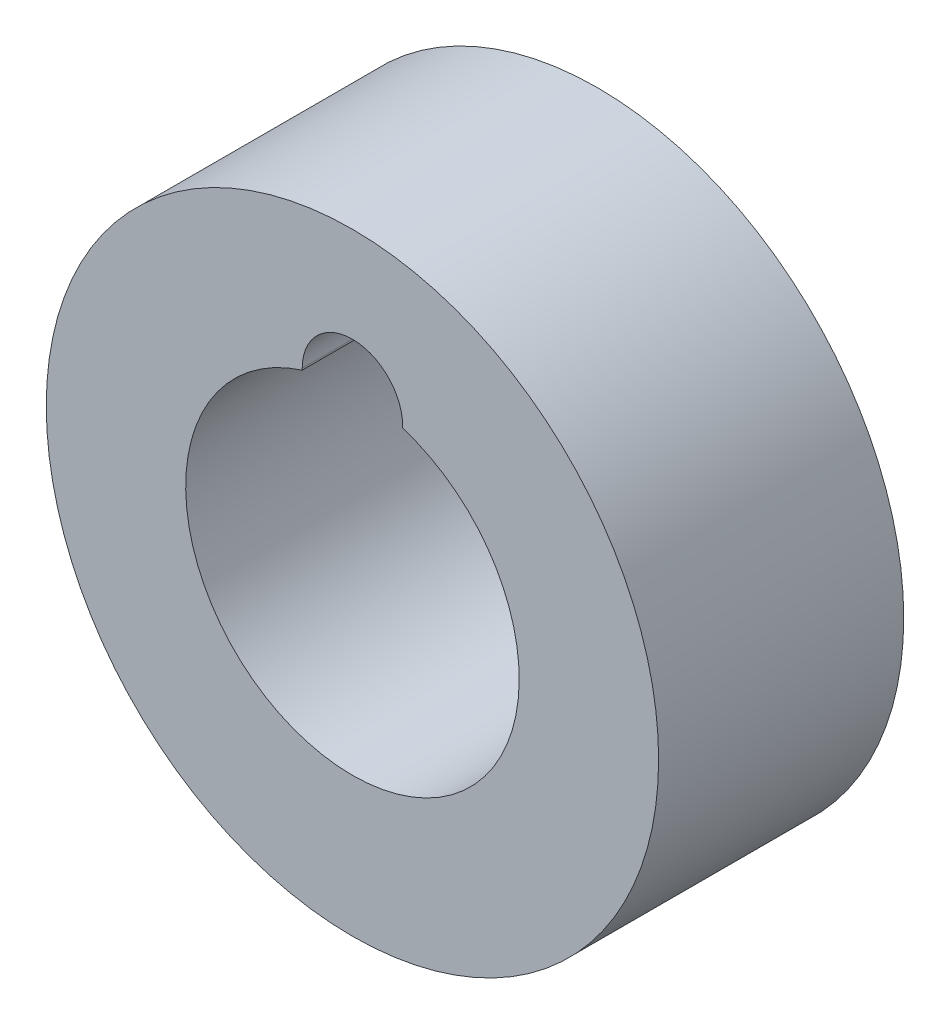
ISO-10303-21;
HEADER;
FILE_DESCRIPTION(('STEP AP214'),'2;1');
FILE_NAME('part.step','',(''),(''),'','','');
FILE_SCHEMA(('AUTOMOTIVE_DESIGN { 1 0 10303 214 1 1 1 1 }'));
ENDSEC;
DATA;
#1=APPLICATION_CONTEXT('core data for automotive mechanical design processes');
#2=APPLICATION_PROTOCOL_DEFINITION('international standard','automotive_design',2000,#1);
#3=PRODUCT_CONTEXT('',#1,'mechanical');
#4=PRODUCT('Part','Part','',(#3));
#5=PRODUCT_RELATED_PRODUCT_CATEGORY('part','',(#4));
#6=PRODUCT_DEFINITION_FORMATION('','',#4);
#7=PRODUCT_DEFINITION_CONTEXT('part definition',#1,'design');
#8=PRODUCT_DEFINITION('design','',#6,#7);
#9=PRODUCT_DEFINITION_SHAPE('','',#8);
#10=(LENGTH_UNIT() NAMED_UNIT(*) SI_UNIT(.MILLI.,.METRE.));
#11=(NAMED_UNIT(*) PLANE_ANGLE_UNIT() SI_UNIT($,.RADIAN.));
#12=(NAMED_UNIT(*) SI_UNIT($,.STERADIAN.) SOLID_ANGLE_UNIT());
#13=UNCERTAINTY_MEASURE_WITH_UNIT(LENGTH_MEASURE(1.E-05),#10,'distance_accuracy_value','');
#14=(GEOMETRIC_REPRESENTATION_CONTEXT(3) GLOBAL_UNCERTAINTY_ASSIGNED_CONTEXT((#13)) GLOBAL_UNIT_ASSIGNED_CONTEXT((#10,
#11,#12)) REPRESENTATION_CONTEXT('',''));
#15=CARTESIAN_POINT('',(0.,0.,0.));
#16=DIRECTION('',(0.,0.,1.));
#17=DIRECTION('',(1.,0.,0.));
#18=AXIS2_PLACEMENT_3D('',#15,#16,#17);
#19=CARTESIAN_POINT('',(0.,0.,6.099999992));
#20=DIRECTION('',(0.,0.,1.));
#21=DIRECTION('',(1.,0.,0.));
#22=AXIS2_PLACEMENT_3D('',#19,#20,#21);
#23=PLANE('',#22);
#24=DIRECTION('',(0.,-1.,0.));
#25=VECTOR('',#24,1.);
#26=CARTESIAN_POINT('',(-1.25,0.,6.099999992));
#27=LINE('',#26,#25);
#28=CARTESIAN_POINT('',(-1.25,4.,6.099999992));
#29=VERTEX_POINT('',#28);
#30=CARTESIAN_POINT('',(-1.25,3.95727178748188,6.099999992));
#31=VERTEX_POINT('',#30);
#32=EDGE_CURVE('E90',#29,#31,#27,.T.);
#33=ORIENTED_EDGE('',*,*,#32,.F.);
#34=CARTESIAN_POINT('',(0.,4.,6.099999992));
#35=DIRECTION('',(0.,0.,1.));
#36=DIRECTION('',(1.,0.,0.));
#37=AXIS2_PLACEMENT_3D('',#34,#35,#36);
#38=CIRCLE('',#37,1.25);
#39=CARTESIAN_POINT('',(1.25,4.,6.099999992));
#40=VERTEX_POINT('',#39);
#41=EDGE_CURVE('E92',#40,#29,#38,.T.);
#42=ORIENTED_EDGE('',*,*,#41,.F.);
#43=DIRECTION('',(0.,1.,0.));
#44=VECTOR('',#43,1.);
#45=CARTESIAN_POINT('',(1.25,0.,6.099999992));
#46=LINE('',#45,#44);
#47=CARTESIAN_POINT('',(1.25,3.95727178748188,6.099999992));
#48=VERTEX_POINT('',#47);
#49=EDGE_CURVE('E74',#48,#40,#46,.T.);
#50=ORIENTED_EDGE('',*,*,#49,.F.);
#51=CARTESIAN_POINT('',(0.,0.,6.099999992));
#52=DIRECTION('',(0.,0.,1.));
#53=DIRECTION('',(1.,0.,0.));
#54=AXIS2_PLACEMENT_3D('',#51,#52,#53);
#55=CIRCLE('',#54,4.15);
#56=EDGE_CURVE('E99',#31,#48,#55,.T.);
#57=ORIENTED_EDGE('',*,*,#56,.F.);
#58=EDGE_LOOP('',(#33,#42,#50,#57));
#59=FACE_BOUND('',#58,.T.);
#60=CARTESIAN_POINT('',(0.,0.,6.099999992));
#61=DIRECTION('',(0.,0.,1.));
#62=DIRECTION('',(1.,0.,0.));
#63=AXIS2_PLACEMENT_3D('',#60,#61,#62);
#64=CIRCLE('',#63,7.62);
#65=CARTESIAN_POINT('',(-7.62,0.,6.099999992));
#66=VERTEX_POINT('',#65);
#67=EDGE_CURVE('E104',#66,#66,#64,.T.);
#68=ORIENTED_EDGE('',*,*,#67,.T.);
#69=EDGE_LOOP('',(#68));
#70=FACE_BOUND('',#69,.T.);
#71=ADVANCED_FACE('F32',(#59,#70),#23,.T.);
#72=CARTESIAN_POINT('',(0.,0.,0.));
#73=DIRECTION('',(0.,0.,1.));
#74=DIRECTION('',(1.,0.,0.));
#75=AXIS2_PLACEMENT_3D('',#72,#73,#74);
#76=PLANE('',#75);
#77=CARTESIAN_POINT('',(0.,0.,0.));
#78=DIRECTION('',(0.,0.,1.));
#79=DIRECTION('',(1.,0.,0.));
#80=AXIS2_PLACEMENT_3D('',#77,#78,#79);
#81=CIRCLE('',#80,7.62);
#82=CARTESIAN_POINT('',(-7.62,0.,0.));
#83=VERTEX_POINT('',#82);
#84=EDGE_CURVE('E102',#83,#83,#81,.T.);
#85=ORIENTED_EDGE('',*,*,#84,.F.);
#86=EDGE_LOOP('',(#85));
#87=FACE_BOUND('',#86,.T.);
#88=CARTESIAN_POINT('',(0.,4.,0.));
#89=DIRECTION('',(0.,0.,1.));
#90=DIRECTION('',(1.,0.,0.));
#91=AXIS2_PLACEMENT_3D('',#88,#89,#90);
#92=CIRCLE('',#91,1.25);
#93=CARTESIAN_POINT('',(1.25,4.,0.));
#94=VERTEX_POINT('',#93);
#95=CARTESIAN_POINT('',(-1.25,4.,0.));
#96=VERTEX_POINT('',#95);
#97=EDGE_CURVE('E82',#94,#96,#92,.T.);
#98=ORIENTED_EDGE('',*,*,#97,.T.);
#99=DIRECTION('',(0.,-1.,0.));
#100=VECTOR('',#99,1.);
#101=CARTESIAN_POINT('',(-1.25,0.,0.));
#102=LINE('',#101,#100);
#103=CARTESIAN_POINT('',(-1.25,3.95727178748188,0.));
#104=VERTEX_POINT('',#103);
#105=EDGE_CURVE('E79',#96,#104,#102,.T.);
#106=ORIENTED_EDGE('',*,*,#105,.T.);
#107=CARTESIAN_POINT('',(0.,0.,0.));
#108=DIRECTION('',(0.,0.,1.));
#109=DIRECTION('',(1.,0.,0.));
#110=AXIS2_PLACEMENT_3D('',#107,#108,#109);
#111=CIRCLE('',#110,4.15);
#112=CARTESIAN_POINT('',(1.25,3.95727178748188,0.));
#113=VERTEX_POINT('',#112);
#114=EDGE_CURVE('E89',#104,#113,#111,.T.);
#115=ORIENTED_EDGE('',*,*,#114,.T.);
#116=DIRECTION('',(0.,1.,0.));
#117=VECTOR('',#116,1.);
#118=CARTESIAN_POINT('',(1.25,0.,0.));
#119=LINE('',#118,#117);
#120=EDGE_CURVE('E47',#113,#94,#119,.T.);
#121=ORIENTED_EDGE('',*,*,#120,.T.);
#122=EDGE_LOOP('',(#98,#106,#115,#121));
#123=FACE_BOUND('',#122,.T.);
#124=ADVANCED_FACE('F87',(#87,#123),#76,.F.);
#125=CARTESIAN_POINT('',(0.,0.,6.099999992));
#126=DIRECTION('',(0.,0.,-1.));
#127=DIRECTION('',(-1.,0.,0.));
#128=AXIS2_PLACEMENT_3D('',#125,#126,#127);
#129=CYLINDRICAL_SURFACE('',#128,7.62);
#130=CARTESIAN_POINT('',(-7.62,0.,6.099999992));
#131=CARTESIAN_POINT('',(-7.62,0.,6.03645832541667));
#132=CARTESIAN_POINT('',(-7.62,0.,5.97291665883333));
#133=CARTESIAN_POINT('',(-7.62,0.,5.84583332566667));
#134=CARTESIAN_POINT('',(-7.62,0.,5.78229165908333));
#135=CARTESIAN_POINT('',(-7.62,0.,5.65520832591667));
#136=CARTESIAN_POINT('',(-7.62,0.,5.59166665933333));
#137=CARTESIAN_POINT('',(-7.62,0.,5.46458332616667));
#138=CARTESIAN_POINT('',(-7.62,0.,5.40104165958333));
#139=CARTESIAN_POINT('',(-7.62,0.,5.27395832641667));
#140=CARTESIAN_POINT('',(-7.62,0.,5.21041665983333));
#141=CARTESIAN_POINT('',(-7.62,0.,5.08333332666667));
#142=CARTESIAN_POINT('',(-7.62,0.,5.01979166008333));
#143=CARTESIAN_POINT('',(-7.62,0.,4.89270832691667));
#144=CARTESIAN_POINT('',(-7.62,0.,4.82916666033333));
#145=CARTESIAN_POINT('',(-7.62,0.,4.70208332716667));
#146=CARTESIAN_POINT('',(-7.62,0.,4.63854166058333));
#147=CARTESIAN_POINT('',(-7.62,0.,4.51145832741667));
#148=CARTESIAN_POINT('',(-7.62,0.,4.44791666083333));
#149=CARTESIAN_POINT('',(-7.62,0.,4.32083332766667));
#150=CARTESIAN_POINT('',(-7.62,0.,4.25729166108333));
#151=CARTESIAN_POINT('',(-7.62,0.,4.13020832791667));
#152=CARTESIAN_POINT('',(-7.62,0.,4.06666666133333));
#153=CARTESIAN_POINT('',(-7.62,0.,3.93958332816667));
#154=CARTESIAN_POINT('',(-7.62,0.,3.87604166158333));
#155=CARTESIAN_POINT('',(-7.62,0.,3.74895832841667));
#156=CARTESIAN_POINT('',(-7.62,0.,3.68541666183333));
#157=CARTESIAN_POINT('',(-7.62,0.,3.55833332866667));
#158=CARTESIAN_POINT('',(-7.62,0.,3.49479166208333));
#159=CARTESIAN_POINT('',(-7.62,0.,3.36770832891667));
#160=CARTESIAN_POINT('',(-7.62,0.,3.30416666233333));
#161=CARTESIAN_POINT('',(-7.62,0.,3.17708332916667));
#162=CARTESIAN_POINT('',(-7.62,0.,3.11354166258333));
#163=CARTESIAN_POINT('',(-7.62,0.,2.98645832941667));
#164=CARTESIAN_POINT('',(-7.62,0.,2.92291666283333));
#165=CARTESIAN_POINT('',(-7.62,0.,2.79583332966667));
#166=CARTESIAN_POINT('',(-7.62,0.,2.73229166308333));
#167=CARTESIAN_POINT('',(-7.62,0.,2.60520832991667));
#168=CARTESIAN_POINT('',(-7.62,0.,2.54166666333333));
#169=CARTESIAN_POINT('',(-7.62,0.,2.41458333016667));
#170=CARTESIAN_POINT('',(-7.62,0.,2.35104166358333));
#171=CARTESIAN_POINT('',(-7.62,0.,2.22395833041667));
#172=CARTESIAN_POINT('',(-7.62,0.,2.16041666383333));
#173=CARTESIAN_POINT('',(-7.62,0.,2.03333333066667));
#174=CARTESIAN_POINT('',(-7.62,0.,1.96979166408333));
#175=CARTESIAN_POINT('',(-7.62,0.,1.84270833091667));
#176=CARTESIAN_POINT('',(-7.62,0.,1.77916666433333));
#177=CARTESIAN_POINT('',(-7.62,0.,1.65208333116667));
#178=CARTESIAN_POINT('',(-7.62,0.,1.58854166458333));
#179=CARTESIAN_POINT('',(-7.62,0.,1.46145833141667));
#180=CARTESIAN_POINT('',(-7.62,0.,1.39791666483333));
#181=CARTESIAN_POINT('',(-7.62,0.,1.27083333166667));
#182=CARTESIAN_POINT('',(-7.62,0.,1.20729166508333));
#183=CARTESIAN_POINT('',(-7.62,0.,1.08020833191667));
#184=CARTESIAN_POINT('',(-7.62,0.,1.01666666533333));
#185=CARTESIAN_POINT('',(-7.62,0.,0.889583332166667));
#186=CARTESIAN_POINT('',(-7.62,0.,0.826041665583333));
#187=CARTESIAN_POINT('',(-7.62,0.,0.698958332416667));
#188=CARTESIAN_POINT('',(-7.62,0.,0.635416665833334));
#189=CARTESIAN_POINT('',(-7.62,0.,0.508333332666667));
#190=CARTESIAN_POINT('',(-7.62,0.,0.444791666083334));
#191=CARTESIAN_POINT('',(-7.62,0.,0.317708332916667));
#192=CARTESIAN_POINT('',(-7.62,0.,0.254166666333334));
#193=CARTESIAN_POINT('',(-7.62,0.,0.127083333166667));
#194=CARTESIAN_POINT('',(-7.62,0.,0.0635416665833333));
#195=CARTESIAN_POINT('',(-7.62,0.,0.));
#196=B_SPLINE_CURVE_WITH_KNOTS('',3,(#130,#131,#132,#133,#134,#135,#136,#137,#138,#139,#140,
#141,#142,#143,#144,#145,#146,#147,#148,#149,#150,#151,#152,#153,#154,#155,#156,#157,#158,#159,
#160,#161,#162,#163,#164,#165,#166,#167,#168,#169,#170,#171,#172,#173,#174,#175,#176,#177,#178,
#179,#180,#181,#182,#183,#184,#185,#186,#187,#188,#189,#190,#191,#192,#193,#194,#195),
.UNSPECIFIED.,.F.,.F.,(4,2,2,2,2,2,2,2,2,2,2,2,2,2,2,2,2,2,2,2,2,2,2,2,2,2,2,2,2,2,2,2,4),(0.,
0.190624999749999,0.381249999499999,0.57187499925,0.762499999,0.95312499875,1.1437499985,
1.33437499825,1.524999998,1.71562499775,1.9062499975,2.09687499725,2.287499997,2.47812499675,
2.6687499965,2.85937499625,3.049999996,3.24062499575,3.4312499955,3.62187499525,3.812499995,
4.00312499475,4.1937499945,4.38437499425,4.574999994,4.76562499375,4.9562499935,5.14687499325,
5.337499993,5.52812499275,5.7187499925,5.90937499225,6.099999992),.UNSPECIFIED.);
#197=EDGE_CURVE('BSEAM34',#66,#83,#196,.T.);
#198=ORIENTED_EDGE('',*,*,#67,.F.);
#199=ORIENTED_EDGE('',*,*,#84,.T.);
#200=ORIENTED_EDGE('',*,*,#197,.T.);
#201=ORIENTED_EDGE('',*,*,#197,.F.);
#202=EDGE_LOOP('',(#198,#200,#199,#201));
#203=FACE_BOUND('',#202,.T.);
#204=ADVANCED_FACE('F34',(#203),#129,.T.);
#205=CARTESIAN_POINT('',(0.,0.,6.099999992));
#206=DIRECTION('',(0.,0.,-1.));
#207=DIRECTION('',(-1.,0.,0.));
#208=AXIS2_PLACEMENT_3D('',#205,#206,#207);
#209=CYLINDRICAL_SURFACE('',#208,4.15);
#210=DIRECTION('',(0.,0.,-1.));
#211=VECTOR('',#210,1.);
#212=CARTESIAN_POINT('',(-1.25,3.95727178748187,6.099999992));
#213=LINE('',#212,#211);
#214=EDGE_CURVE('E11',#31,#104,#213,.T.);
#215=ORIENTED_EDGE('',*,*,#214,.F.);
#216=ORIENTED_EDGE('',*,*,#56,.T.);
#217=DIRECTION('',(0.,0.,-1.));
#218=VECTOR('',#217,1.);
#219=CARTESIAN_POINT('',(1.25,3.95727178748187,6.099999992));
#220=LINE('',#219,#218);
#221=EDGE_CURVE('E40',#113,#48,#220,.F.);
#222=ORIENTED_EDGE('',*,*,#221,.F.);
#223=ORIENTED_EDGE('',*,*,#114,.F.);
#224=EDGE_LOOP('',(#215,#216,#222,#223));
#225=FACE_BOUND('',#224,.T.);
#226=ADVANCED_FACE('F113',(#225),#209,.F.);
#227=CARTESIAN_POINT('',(-1.25,0.,0.));
#228=DIRECTION('',(-1.,0.,0.));
#229=DIRECTION('',(0.,0.,1.));
#230=AXIS2_PLACEMENT_3D('',#227,#228,#229);
#231=PLANE('',#230);
#232=ORIENTED_EDGE('',*,*,#214,.T.);
#233=ORIENTED_EDGE('',*,*,#105,.F.);
#234=DIRECTION('',(0.,0.,1.));
#235=VECTOR('',#234,1.);
#236=CARTESIAN_POINT('',(-1.25,4.,0.));
#237=LINE('',#236,#235);
#238=EDGE_CURVE('E78',#96,#29,#237,.T.);
#239=ORIENTED_EDGE('',*,*,#238,.T.);
#240=ORIENTED_EDGE('',*,*,#32,.T.);
#241=EDGE_LOOP('',(#232,#233,#239,#240));
#242=FACE_BOUND('',#241,.T.);
#243=ADVANCED_FACE('F115',(#242),#231,.F.);
#244=CARTESIAN_POINT('',(0.,4.,0.));
#245=DIRECTION('',(0.,0.,1.));
#246=DIRECTION('',(1.,0.,0.));
#247=AXIS2_PLACEMENT_3D('',#244,#245,#246);
#248=CYLINDRICAL_SURFACE('',#247,1.25);
#249=ORIENTED_EDGE('',*,*,#41,.T.);
#250=ORIENTED_EDGE('',*,*,#238,.F.);
#251=ORIENTED_EDGE('',*,*,#97,.F.);
#252=DIRECTION('',(0.,0.,1.));
#253=VECTOR('',#252,1.);
#254=CARTESIAN_POINT('',(1.25,4.,0.));
#255=LINE('',#254,#253);
#256=EDGE_CURVE('E70',#94,#40,#255,.T.);
#257=ORIENTED_EDGE('',*,*,#256,.T.);
#258=EDGE_LOOP('',(#249,#250,#251,#257));
#259=FACE_BOUND('',#258,.T.);
#260=ADVANCED_FACE('F83',(#259),#248,.F.);
#261=CARTESIAN_POINT('',(1.25,0.,0.));
#262=DIRECTION('',(1.,0.,0.));
#263=DIRECTION('',(0.,0.,-1.));
#264=AXIS2_PLACEMENT_3D('',#261,#262,#263);
#265=PLANE('',#264);
#266=ORIENTED_EDGE('',*,*,#221,.T.);
#267=ORIENTED_EDGE('',*,*,#49,.T.);
#268=ORIENTED_EDGE('',*,*,#256,.F.);
#269=ORIENTED_EDGE('',*,*,#120,.F.);
#270=EDGE_LOOP('',(#266,#267,#268,#269));
#271=FACE_BOUND('',#270,.T.);
#272=ADVANCED_FACE('F72',(#271),#265,.F.);
#273=CLOSED_SHELL('',(#71,#124,#204,#226,#243,#260,#272));
#274=MANIFOLD_SOLID_BREP('B2',#273);
#275=ADVANCED_BREP_SHAPE_REPRESENTATION('',(#18,#274),#14);
#276=SHAPE_DEFINITION_REPRESENTATION(#9,#275);
ENDSEC;
END-ISO-10303-21;
